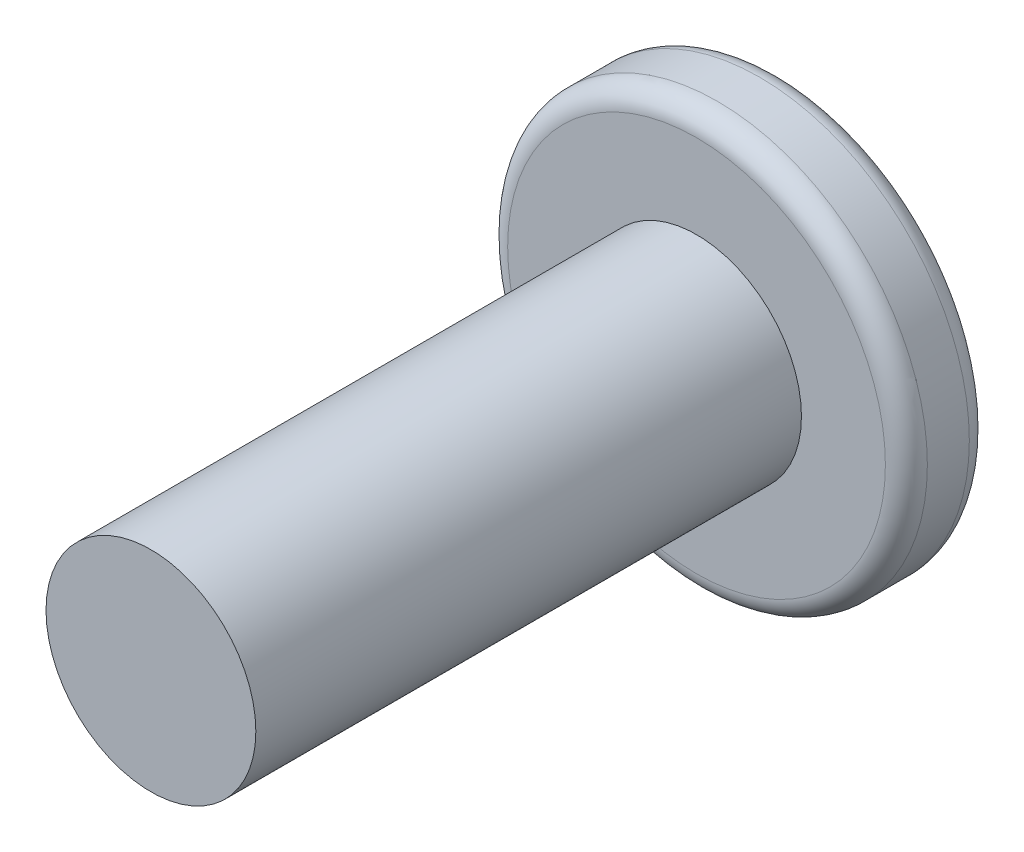
ISO-10303-21;
HEADER;
FILE_DESCRIPTION(('STEP AP214'),'2;1');
FILE_NAME('part.step','',(''),(''),'','','');
FILE_SCHEMA(('AUTOMOTIVE_DESIGN { 1 0 10303 214 1 1 1 1 }'));
ENDSEC;
DATA;
#1=APPLICATION_CONTEXT('core data for automotive mechanical design processes');
#2=APPLICATION_PROTOCOL_DEFINITION('international standard','automotive_design',2000,#1);
#3=PRODUCT_CONTEXT('',#1,'mechanical');
#4=PRODUCT('Part','Part','',(#3));
#5=PRODUCT_RELATED_PRODUCT_CATEGORY('part','',(#4));
#6=PRODUCT_DEFINITION_FORMATION('','',#4);
#7=PRODUCT_DEFINITION_CONTEXT('part definition',#1,'design');
#8=PRODUCT_DEFINITION('design','',#6,#7);
#9=PRODUCT_DEFINITION_SHAPE('','',#8);
#10=(LENGTH_UNIT() NAMED_UNIT(*) SI_UNIT(.MILLI.,.METRE.));
#11=(NAMED_UNIT(*) PLANE_ANGLE_UNIT() SI_UNIT($,.RADIAN.));
#12=(NAMED_UNIT(*) SI_UNIT($,.STERADIAN.) SOLID_ANGLE_UNIT());
#13=UNCERTAINTY_MEASURE_WITH_UNIT(LENGTH_MEASURE(1.E-05),#10,'distance_accuracy_value','');
#14=(GEOMETRIC_REPRESENTATION_CONTEXT(3) GLOBAL_UNCERTAINTY_ASSIGNED_CONTEXT((#13)) GLOBAL_UNIT_ASSIGNED_CONTEXT((#10,
#11,#12)) REPRESENTATION_CONTEXT('',''));
#15=CARTESIAN_POINT('',(0.,0.,0.));
#16=DIRECTION('',(0.,0.,1.));
#17=DIRECTION('',(1.,0.,0.));
#18=AXIS2_PLACEMENT_3D('',#15,#16,#17);
#19=CARTESIAN_POINT('',(0.,0.,-0.8));
#20=DIRECTION('',(0.,0.,1.));
#21=DIRECTION('',(1.,0.,0.));
#22=AXIS2_PLACEMENT_3D('',#19,#20,#21);
#23=PLANE('',#22);
#24=DIRECTION('',(0.5,0.866025403784438,0.));
#25=VECTOR('',#24,1.);
#26=CARTESIAN_POINT('',(-0.866025403784439,0.,-0.8));
#27=LINE('',#26,#25);
#28=CARTESIAN_POINT('',(-0.866025403784439,0.,-0.8));
#29=VERTEX_POINT('',#28);
#30=CARTESIAN_POINT('',(-0.433012701892219,0.75,-0.8));
#31=VERTEX_POINT('',#30);
#32=EDGE_CURVE('E123',#29,#31,#27,.T.);
#33=ORIENTED_EDGE('',*,*,#32,.F.);
#34=DIRECTION('',(-0.5,0.866025403784439,0.));
#35=VECTOR('',#34,1.);
#36=CARTESIAN_POINT('',(-0.433012701892219,-0.75,-0.8));
#37=LINE('',#36,#35);
#38=CARTESIAN_POINT('',(-0.433012701892219,-0.75,-0.8));
#39=VERTEX_POINT('',#38);
#40=EDGE_CURVE('E49',#39,#29,#37,.T.);
#41=ORIENTED_EDGE('',*,*,#40,.F.);
#42=DIRECTION('',(-1.,0.,0.));
#43=VECTOR('',#42,1.);
#44=CARTESIAN_POINT('',(0.433012701892219,-0.75,-0.8));
#45=LINE('',#44,#43);
#46=CARTESIAN_POINT('',(0.433012701892219,-0.75,-0.8));
#47=VERTEX_POINT('',#46);
#48=EDGE_CURVE('E132',#47,#39,#45,.T.);
#49=ORIENTED_EDGE('',*,*,#48,.F.);
#50=DIRECTION('',(-0.5,-0.866025403784438,0.));
#51=VECTOR('',#50,1.);
#52=CARTESIAN_POINT('',(0.866025403784439,0.,-0.8));
#53=LINE('',#52,#51);
#54=CARTESIAN_POINT('',(0.866025403784439,0.,-0.8));
#55=VERTEX_POINT('',#54);
#56=EDGE_CURVE('E130',#55,#47,#53,.T.);
#57=ORIENTED_EDGE('',*,*,#56,.F.);
#58=DIRECTION('',(0.5,-0.866025403784438,0.));
#59=VECTOR('',#58,1.);
#60=CARTESIAN_POINT('',(0.433012701892219,0.75,-0.8));
#61=LINE('',#60,#59);
#62=CARTESIAN_POINT('',(0.433012701892219,0.75,-0.8));
#63=VERTEX_POINT('',#62);
#64=EDGE_CURVE('E97',#63,#55,#61,.T.);
#65=ORIENTED_EDGE('',*,*,#64,.F.);
#66=DIRECTION('',(1.,0.,0.));
#67=VECTOR('',#66,1.);
#68=CARTESIAN_POINT('',(-0.433012701892219,0.75,-0.8));
#69=LINE('',#68,#67);
#70=EDGE_CURVE('E126',#31,#63,#69,.T.);
#71=ORIENTED_EDGE('',*,*,#70,.F.);
#72=EDGE_LOOP('',(#33,#41,#49,#57,#65,#71));
#73=FACE_BOUND('',#72,.T.);
#74=CARTESIAN_POINT('',(0.,0.,-0.8));
#75=DIRECTION('',(0.,0.,-1.));
#76=DIRECTION('',(-1.,0.,0.));
#77=AXIS2_PLACEMENT_3D('',#74,#75,#76);
#78=CIRCLE('',#77,1.8);
#79=CARTESIAN_POINT('',(-1.8,0.,-0.799999999999999));
#80=VERTEX_POINT('',#79);
#81=EDGE_CURVE('E11',#80,#80,#78,.T.);
#82=ORIENTED_EDGE('',*,*,#81,.T.);
#83=EDGE_LOOP('',(#82));
#84=FACE_BOUND('',#83,.T.);
#85=ADVANCED_FACE('F35',(#73,#84),#23,.F.);
#86=CARTESIAN_POINT('',(0.,0.,-0.6));
#87=DIRECTION('',(0.,0.,-1.));
#88=DIRECTION('',(-1.,0.,0.));
#89=AXIS2_PLACEMENT_3D('',#86,#87,#88);
#90=TOROIDAL_SURFACE('',#89,1.8,0.2);
#91=ORIENTED_EDGE('',*,*,#81,.F.);
#92=EDGE_LOOP('',(#91));
#93=FACE_BOUND('',#92,.T.);
#94=CARTESIAN_POINT('',(0.,0.,-0.599999999999999));
#95=DIRECTION('',(0.,0.,-1.));
#96=DIRECTION('',(-1.,0.,0.));
#97=AXIS2_PLACEMENT_3D('',#94,#95,#96);
#98=CIRCLE('',#97,2.);
#99=CARTESIAN_POINT('',(-2.,0.,-0.599999999999998));
#100=VERTEX_POINT('',#99);
#101=EDGE_CURVE('E42',#100,#100,#98,.T.);
#102=ORIENTED_EDGE('',*,*,#101,.T.);
#103=EDGE_LOOP('',(#102));
#104=FACE_BOUND('',#103,.T.);
#105=ADVANCED_FACE('F155',(#93,#104),#90,.T.);
#106=CARTESIAN_POINT('',(0.,0.,0.));
#107=DIRECTION('',(0.,0.,-1.));
#108=DIRECTION('',(-1.,0.,0.));
#109=AXIS2_PLACEMENT_3D('',#106,#107,#108);
#110=CYLINDRICAL_SURFACE('',#109,2.);
#111=ORIENTED_EDGE('',*,*,#101,.F.);
#112=EDGE_LOOP('',(#111));
#113=FACE_BOUND('',#112,.T.);
#114=CARTESIAN_POINT('',(0.,0.,-0.200000000000001));
#115=DIRECTION('',(0.,0.,-1.));
#116=DIRECTION('',(-1.,0.,0.));
#117=AXIS2_PLACEMENT_3D('',#114,#115,#116);
#118=CIRCLE('',#117,2.);
#119=CARTESIAN_POINT('',(-2.,0.,-0.200000000000001));
#120=VERTEX_POINT('',#119);
#121=EDGE_CURVE('E150',#120,#120,#118,.T.);
#122=ORIENTED_EDGE('',*,*,#121,.T.);
#123=EDGE_LOOP('',(#122));
#124=FACE_BOUND('',#123,.T.);
#125=ADVANCED_FACE('F157',(#113,#124),#110,.T.);
#126=CARTESIAN_POINT('',(0.,0.,-0.2));
#127=DIRECTION('',(0.,0.,-1.));
#128=DIRECTION('',(-1.,0.,0.));
#129=AXIS2_PLACEMENT_3D('',#126,#127,#128);
#130=TOROIDAL_SURFACE('',#129,1.8,0.2);
#131=ORIENTED_EDGE('',*,*,#121,.F.);
#132=EDGE_LOOP('',(#131));
#133=FACE_BOUND('',#132,.T.);
#134=CARTESIAN_POINT('',(0.,0.,0.));
#135=DIRECTION('',(0.,0.,-1.));
#136=DIRECTION('',(-1.,0.,0.));
#137=AXIS2_PLACEMENT_3D('',#134,#135,#136);
#138=CIRCLE('',#137,1.8);
#139=CARTESIAN_POINT('',(-1.8,0.,0.));
#140=VERTEX_POINT('',#139);
#141=EDGE_CURVE('E147',#140,#140,#138,.T.);
#142=ORIENTED_EDGE('',*,*,#141,.T.);
#143=EDGE_LOOP('',(#142));
#144=FACE_BOUND('',#143,.T.);
#145=ADVANCED_FACE('F160',(#133,#144),#130,.T.);
#146=CARTESIAN_POINT('',(1.,0.,0.));
#147=DIRECTION('',(0.,0.,-1.));
#148=DIRECTION('',(-1.,0.,0.));
#149=AXIS2_PLACEMENT_3D('',#146,#147,#148);
#150=PLANE('',#149);
#151=ORIENTED_EDGE('',*,*,#141,.F.);
#152=EDGE_LOOP('',(#151));
#153=FACE_BOUND('',#152,.T.);
#154=CARTESIAN_POINT('',(0.,0.,0.));
#155=DIRECTION('',(0.,0.,-1.));
#156=DIRECTION('',(-1.,0.,0.));
#157=AXIS2_PLACEMENT_3D('',#154,#155,#156);
#158=CIRCLE('',#157,1.);
#159=CARTESIAN_POINT('',(-1.,0.,0.));
#160=VERTEX_POINT('',#159);
#161=EDGE_CURVE('E144',#160,#160,#158,.T.);
#162=ORIENTED_EDGE('',*,*,#161,.T.);
#163=EDGE_LOOP('',(#162));
#164=FACE_BOUND('',#163,.T.);
#165=ADVANCED_FACE('F166',(#153,#164),#150,.F.);
#166=CARTESIAN_POINT('',(0.,0.,0.));
#167=DIRECTION('',(0.,0.,-1.));
#168=DIRECTION('',(-1.,0.,0.));
#169=AXIS2_PLACEMENT_3D('',#166,#167,#168);
#170=CYLINDRICAL_SURFACE('',#169,1.);
#171=ORIENTED_EDGE('',*,*,#161,.F.);
#172=EDGE_LOOP('',(#171));
#173=FACE_BOUND('',#172,.T.);
#174=CARTESIAN_POINT('',(0.,0.,5.2));
#175=DIRECTION('',(0.,0.,-1.));
#176=DIRECTION('',(-1.,0.,0.));
#177=AXIS2_PLACEMENT_3D('',#174,#175,#176);
#178=CIRCLE('',#177,1.);
#179=CARTESIAN_POINT('',(-0.999999999999999,0.,5.2));
#180=VERTEX_POINT('',#179);
#181=EDGE_CURVE('E136',#180,#180,#178,.T.);
#182=ORIENTED_EDGE('',*,*,#181,.T.);
#183=EDGE_LOOP('',(#182));
#184=FACE_BOUND('',#183,.T.);
#185=ADVANCED_FACE('F172',(#173,#184),#170,.T.);
#186=CARTESIAN_POINT('',(0.,0.,5.2));
#187=DIRECTION('',(0.,0.,-1.));
#188=DIRECTION('',(-1.,0.,0.));
#189=AXIS2_PLACEMENT_3D('',#186,#187,#188);
#190=PLANE('',#189);
#191=ORIENTED_EDGE('',*,*,#181,.F.);
#192=EDGE_LOOP('',(#191));
#193=FACE_BOUND('',#192,.T.);
#194=ADVANCED_FACE('F178',(#193),#190,.F.);
#195=CARTESIAN_POINT('',(-0.433012701892219,-0.75,0.7));
#196=DIRECTION('',(-0.866025403784439,-0.5,0.));
#197=DIRECTION('',(0.5,-0.866025403784439,0.));
#198=AXIS2_PLACEMENT_3D('',#195,#196,#197);
#199=PLANE('',#198);
#200=ORIENTED_EDGE('',*,*,#40,.T.);
#201=DIRECTION('',(0.,0.,-1.));
#202=VECTOR('',#201,1.);
#203=CARTESIAN_POINT('',(-0.866025403784439,0.,0.7));
#204=LINE('',#203,#202);
#205=CARTESIAN_POINT('',(-0.866025403784439,0.,0.7));
#206=VERTEX_POINT('',#205);
#207=EDGE_CURVE('E79',#206,#29,#204,.T.);
#208=ORIENTED_EDGE('',*,*,#207,.F.);
#209=DIRECTION('',(-0.5,0.866025403784439,0.));
#210=VECTOR('',#209,1.);
#211=CARTESIAN_POINT('',(-0.433012701892219,-0.75,0.7));
#212=LINE('',#211,#210);
#213=CARTESIAN_POINT('',(-0.433012701892219,-0.75,0.7));
#214=VERTEX_POINT('',#213);
#215=EDGE_CURVE('E134',#214,#206,#212,.T.);
#216=ORIENTED_EDGE('',*,*,#215,.F.);
#217=DIRECTION('',(0.,0.,-1.));
#218=VECTOR('',#217,1.);
#219=CARTESIAN_POINT('',(-0.433012701892219,-0.75,0.7));
#220=LINE('',#219,#218);
#221=EDGE_CURVE('E57',#214,#39,#220,.T.);
#222=ORIENTED_EDGE('',*,*,#221,.T.);
#223=EDGE_LOOP('',(#200,#208,#216,#222));
#224=FACE_BOUND('',#223,.T.);
#225=ADVANCED_FACE('F183',(#224),#199,.F.);
#226=CARTESIAN_POINT('',(0.433012701892219,-0.75,0.7));
#227=DIRECTION('',(0.,-1.,0.));
#228=DIRECTION('',(0.,0.,-1.));
#229=AXIS2_PLACEMENT_3D('',#226,#227,#228);
#230=PLANE('',#229);
#231=ORIENTED_EDGE('',*,*,#48,.T.);
#232=ORIENTED_EDGE('',*,*,#221,.F.);
#233=DIRECTION('',(-1.,0.,0.));
#234=VECTOR('',#233,1.);
#235=CARTESIAN_POINT('',(0.433012701892219,-0.75,0.7));
#236=LINE('',#235,#234);
#237=CARTESIAN_POINT('',(0.433012701892219,-0.75,0.7));
#238=VERTEX_POINT('',#237);
#239=EDGE_CURVE('E109',#238,#214,#236,.T.);
#240=ORIENTED_EDGE('',*,*,#239,.F.);
#241=DIRECTION('',(0.,0.,-1.));
#242=VECTOR('',#241,1.);
#243=CARTESIAN_POINT('',(0.433012701892219,-0.75,0.7));
#244=LINE('',#243,#242);
#245=EDGE_CURVE('E101',#238,#47,#244,.T.);
#246=ORIENTED_EDGE('',*,*,#245,.T.);
#247=EDGE_LOOP('',(#231,#232,#240,#246));
#248=FACE_BOUND('',#247,.T.);
#249=ADVANCED_FACE('F188',(#248),#230,.F.);
#250=CARTESIAN_POINT('',(0.866025403784439,0.,0.7));
#251=DIRECTION('',(0.866025403784438,-0.5,0.));
#252=DIRECTION('',(0.5,0.866025403784439,0.));
#253=AXIS2_PLACEMENT_3D('',#250,#251,#252);
#254=PLANE('',#253);
#255=ORIENTED_EDGE('',*,*,#56,.T.);
#256=ORIENTED_EDGE('',*,*,#245,.F.);
#257=DIRECTION('',(-0.5,-0.866025403784438,0.));
#258=VECTOR('',#257,1.);
#259=CARTESIAN_POINT('',(0.866025403784439,0.,0.7));
#260=LINE('',#259,#258);
#261=CARTESIAN_POINT('',(0.866025403784439,0.,0.7));
#262=VERTEX_POINT('',#261);
#263=EDGE_CURVE('E105',#262,#238,#260,.T.);
#264=ORIENTED_EDGE('',*,*,#263,.F.);
#265=DIRECTION('',(0.,0.,-1.));
#266=VECTOR('',#265,1.);
#267=CARTESIAN_POINT('',(0.866025403784439,0.,0.7));
#268=LINE('',#267,#266);
#269=EDGE_CURVE('E90',#262,#55,#268,.T.);
#270=ORIENTED_EDGE('',*,*,#269,.T.);
#271=EDGE_LOOP('',(#255,#256,#264,#270));
#272=FACE_BOUND('',#271,.T.);
#273=ADVANCED_FACE('F106',(#272),#254,.F.);
#274=CARTESIAN_POINT('',(0.433012701892219,0.75,0.7));
#275=DIRECTION('',(0.866025403784439,0.5,0.));
#276=DIRECTION('',(-0.5,0.866025403784439,0.));
#277=AXIS2_PLACEMENT_3D('',#274,#275,#276);
#278=PLANE('',#277);
#279=ORIENTED_EDGE('',*,*,#64,.T.);
#280=ORIENTED_EDGE('',*,*,#269,.F.);
#281=DIRECTION('',(0.5,-0.866025403784438,0.));
#282=VECTOR('',#281,1.);
#283=CARTESIAN_POINT('',(0.433012701892219,0.75,0.7));
#284=LINE('',#283,#282);
#285=CARTESIAN_POINT('',(0.433012701892219,0.75,0.7));
#286=VERTEX_POINT('',#285);
#287=EDGE_CURVE('E94',#286,#262,#284,.T.);
#288=ORIENTED_EDGE('',*,*,#287,.F.);
#289=DIRECTION('',(0.,0.,-1.));
#290=VECTOR('',#289,1.);
#291=CARTESIAN_POINT('',(0.433012701892219,0.75,0.7));
#292=LINE('',#291,#290);
#293=EDGE_CURVE('E102',#286,#63,#292,.T.);
#294=ORIENTED_EDGE('',*,*,#293,.T.);
#295=EDGE_LOOP('',(#279,#280,#288,#294));
#296=FACE_BOUND('',#295,.T.);
#297=ADVANCED_FACE('F92',(#296),#278,.F.);
#298=CARTESIAN_POINT('',(-0.433012701892219,0.75,0.7));
#299=DIRECTION('',(0.,1.,0.));
#300=DIRECTION('',(0.,0.,1.));
#301=AXIS2_PLACEMENT_3D('',#298,#299,#300);
#302=PLANE('',#301);
#303=ORIENTED_EDGE('',*,*,#70,.T.);
#304=ORIENTED_EDGE('',*,*,#293,.F.);
#305=DIRECTION('',(1.,0.,0.));
#306=VECTOR('',#305,1.);
#307=CARTESIAN_POINT('',(-0.433012701892219,0.75,0.7));
#308=LINE('',#307,#306);
#309=CARTESIAN_POINT('',(-0.433012701892219,0.75,0.7));
#310=VERTEX_POINT('',#309);
#311=EDGE_CURVE('E115',#310,#286,#308,.T.);
#312=ORIENTED_EDGE('',*,*,#311,.F.);
#313=DIRECTION('',(0.,0.,-1.));
#314=VECTOR('',#313,1.);
#315=CARTESIAN_POINT('',(-0.433012701892219,0.75,0.7));
#316=LINE('',#315,#314);
#317=EDGE_CURVE('E139',#310,#31,#316,.T.);
#318=ORIENTED_EDGE('',*,*,#317,.T.);
#319=EDGE_LOOP('',(#303,#304,#312,#318));
#320=FACE_BOUND('',#319,.T.);
#321=ADVANCED_FACE('F214',(#320),#302,.F.);
#322=CARTESIAN_POINT('',(-0.866025403784439,0.,0.7));
#323=DIRECTION('',(-0.866025403784439,0.5,0.));
#324=DIRECTION('',(-0.5,-0.866025403784439,0.));
#325=AXIS2_PLACEMENT_3D('',#322,#323,#324);
#326=PLANE('',#325);
#327=ORIENTED_EDGE('',*,*,#32,.T.);
#328=ORIENTED_EDGE('',*,*,#317,.F.);
#329=DIRECTION('',(0.5,0.866025403784438,0.));
#330=VECTOR('',#329,1.);
#331=CARTESIAN_POINT('',(-0.866025403784439,0.,0.7));
#332=LINE('',#331,#330);
#333=EDGE_CURVE('E117',#206,#310,#332,.T.);
#334=ORIENTED_EDGE('',*,*,#333,.F.);
#335=ORIENTED_EDGE('',*,*,#207,.T.);
#336=EDGE_LOOP('',(#327,#328,#334,#335));
#337=FACE_BOUND('',#336,.T.);
#338=ADVANCED_FACE('F202',(#337),#326,.F.);
#339=CARTESIAN_POINT('',(0.,0.,0.7));
#340=DIRECTION('',(0.,0.,-1.));
#341=DIRECTION('',(-1.,0.,0.));
#342=AXIS2_PLACEMENT_3D('',#339,#340,#341);
#343=PLANE('',#342);
#344=ORIENTED_EDGE('',*,*,#215,.T.);
#345=ORIENTED_EDGE('',*,*,#333,.T.);
#346=ORIENTED_EDGE('',*,*,#311,.T.);
#347=ORIENTED_EDGE('',*,*,#287,.T.);
#348=ORIENTED_EDGE('',*,*,#263,.T.);
#349=ORIENTED_EDGE('',*,*,#239,.T.);
#350=EDGE_LOOP('',(#344,#345,#346,#347,#348,#349));
#351=FACE_BOUND('',#350,.T.);
#352=ADVANCED_FACE('F112',(#351),#343,.T.);
#353=CLOSED_SHELL('',(#85,#105,#125,#145,#165,#185,#194,#225,#249,#273,#297,#321,#338,#352));
#354=MANIFOLD_SOLID_BREP('B2',#353);
#355=ADVANCED_BREP_SHAPE_REPRESENTATION('',(#18,#354),#14);
#356=SHAPE_DEFINITION_REPRESENTATION(#9,#355);
ENDSEC;
END-ISO-10303-21;
